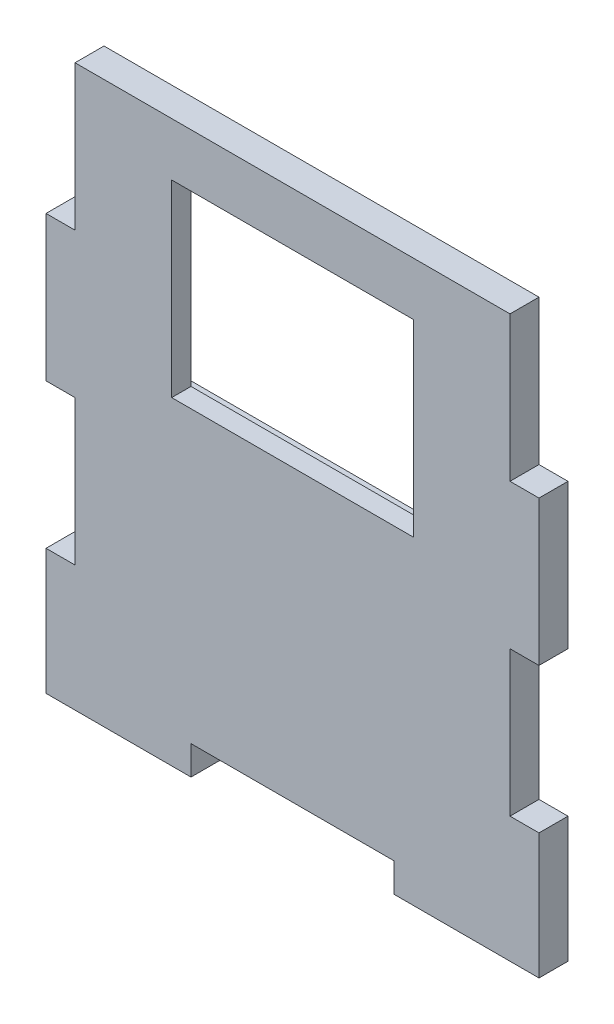
ISO-10303-21;
HEADER;
FILE_DESCRIPTION(('STEP AP214'),'2;1');
FILE_NAME('part.step','',(''),(''),'','','');
FILE_SCHEMA(('AUTOMOTIVE_DESIGN { 1 0 10303 214 1 1 1 1 }'));
ENDSEC;
DATA;
#1=APPLICATION_CONTEXT('core data for automotive mechanical design processes');
#2=APPLICATION_PROTOCOL_DEFINITION('international standard','automotive_design',2000,#1);
#3=PRODUCT_CONTEXT('',#1,'mechanical');
#4=PRODUCT('Part','Part','',(#3));
#5=PRODUCT_RELATED_PRODUCT_CATEGORY('part','',(#4));
#6=PRODUCT_DEFINITION_FORMATION('','',#4);
#7=PRODUCT_DEFINITION_CONTEXT('part definition',#1,'design');
#8=PRODUCT_DEFINITION('design','',#6,#7);
#9=PRODUCT_DEFINITION_SHAPE('','',#8);
#10=(LENGTH_UNIT() NAMED_UNIT(*) SI_UNIT(.MILLI.,.METRE.));
#11=(NAMED_UNIT(*) PLANE_ANGLE_UNIT() SI_UNIT($,.RADIAN.));
#12=(NAMED_UNIT(*) SI_UNIT($,.STERADIAN.) SOLID_ANGLE_UNIT());
#13=UNCERTAINTY_MEASURE_WITH_UNIT(LENGTH_MEASURE(1.E-05),#10,'distance_accuracy_value','');
#14=(GEOMETRIC_REPRESENTATION_CONTEXT(3) GLOBAL_UNCERTAINTY_ASSIGNED_CONTEXT((#13)) GLOBAL_UNIT_ASSIGNED_CONTEXT((#10,
#11,#12)) REPRESENTATION_CONTEXT('',''));
#15=CARTESIAN_POINT('',(0.,0.,0.));
#16=DIRECTION('',(0.,0.,1.));
#17=DIRECTION('',(1.,0.,0.));
#18=AXIS2_PLACEMENT_3D('',#15,#16,#17);
#19=CARTESIAN_POINT('',(-50.001,40.,75.));
#20=DIRECTION('',(0.,1.,0.));
#21=DIRECTION('',(0.,0.,1.));
#22=AXIS2_PLACEMENT_3D('',#19,#20,#21);
#23=PLANE('',#22);
#24=DIRECTION('',(0.,0.,1.));
#25=VECTOR('',#24,1.);
#26=CARTESIAN_POINT('',(-21.,40.,76.));
#27=LINE('',#26,#25);
#28=CARTESIAN_POINT('',(-21.,40.,70.));
#29=VERTEX_POINT('',#28);
#30=CARTESIAN_POINT('',(-21.,40.,76.));
#31=VERTEX_POINT('',#30);
#32=EDGE_CURVE('E275',#29,#31,#27,.T.);
#33=ORIENTED_EDGE('',*,*,#32,.F.);
#34=DIRECTION('',(1.,0.,0.));
#35=VECTOR('',#34,1.);
#36=CARTESIAN_POINT('',(-50.001,40.,70.));
#37=LINE('',#36,#35);
#38=CARTESIAN_POINT('',(21.,40.,70.));
#39=VERTEX_POINT('',#38);
#40=EDGE_CURVE('E417',#29,#39,#37,.T.);
#41=ORIENTED_EDGE('',*,*,#40,.T.);
#42=DIRECTION('',(0.,0.,-1.));
#43=VECTOR('',#42,1.);
#44=CARTESIAN_POINT('',(21.,40.,76.));
#45=LINE('',#44,#43);
#46=CARTESIAN_POINT('',(21.,40.,76.));
#47=VERTEX_POINT('',#46);
#48=EDGE_CURVE('E284',#47,#39,#45,.T.);
#49=ORIENTED_EDGE('',*,*,#48,.F.);
#50=DIRECTION('',(1.,0.,0.));
#51=VECTOR('',#50,1.);
#52=CARTESIAN_POINT('',(-50.,40.,76.));
#53=LINE('',#52,#51);
#54=EDGE_CURVE('E55',#31,#47,#53,.T.);
#55=ORIENTED_EDGE('',*,*,#54,.F.);
#56=EDGE_LOOP('',(#33,#41,#49,#55));
#57=FACE_BOUND('',#56,.T.);
#58=ADVANCED_FACE('F40',(#57),#23,.F.);
#59=CARTESIAN_POINT('',(-50.,150.,70.));
#60=DIRECTION('',(0.,0.,-1.));
#61=DIRECTION('',(-1.,0.,0.));
#62=AXIS2_PLACEMENT_3D('',#59,#60,#61);
#63=PLANE('',#62);
#64=DIRECTION('',(0.,1.,0.));
#65=VECTOR('',#64,1.);
#66=CARTESIAN_POINT('',(-23.,150.,70.));
#67=LINE('',#66,#65);
#68=CARTESIAN_POINT('',(-23.,51.,70.));
#69=VERTEX_POINT('',#68);
#70=CARTESIAN_POINT('',(-23.,96.,70.));
#71=VERTEX_POINT('',#70);
#72=EDGE_CURVE('E11',#69,#71,#67,.T.);
#73=ORIENTED_EDGE('',*,*,#72,.F.);
#74=DIRECTION('',(-1.,0.,0.));
#75=VECTOR('',#74,1.);
#76=CARTESIAN_POINT('',(-50.,51.,70.));
#77=LINE('',#76,#75);
#78=CARTESIAN_POINT('',(23.,51.,70.));
#79=VERTEX_POINT('',#78);
#80=EDGE_CURVE('E489',#79,#69,#77,.T.);
#81=ORIENTED_EDGE('',*,*,#80,.F.);
#82=DIRECTION('',(0.,-1.,0.));
#83=VECTOR('',#82,1.);
#84=CARTESIAN_POINT('',(23.,150.,70.));
#85=LINE('',#84,#83);
#86=CARTESIAN_POINT('',(23.,96.,70.));
#87=VERTEX_POINT('',#86);
#88=EDGE_CURVE('E491',#87,#79,#85,.T.);
#89=ORIENTED_EDGE('',*,*,#88,.F.);
#90=DIRECTION('',(1.,0.,0.));
#91=VECTOR('',#90,1.);
#92=CARTESIAN_POINT('',(-50.,96.,70.));
#93=LINE('',#92,#91);
#94=EDGE_CURVE('E48',#71,#87,#93,.T.);
#95=ORIENTED_EDGE('',*,*,#94,.F.);
#96=EDGE_LOOP('',(#73,#81,#89,#95));
#97=FACE_BOUND('',#96,.T.);
#98=DIRECTION('',(0.,1.,0.));
#99=VECTOR('',#98,1.);
#100=CARTESIAN_POINT('',(-30.,99.,70.));
#101=LINE('',#100,#99);
#102=CARTESIAN_POINT('',(-30.,99.,70.));
#103=VERTEX_POINT('',#102);
#104=CARTESIAN_POINT('',(-30.,140.,70.));
#105=VERTEX_POINT('',#104);
#106=EDGE_CURVE('E434',#103,#105,#101,.T.);
#107=ORIENTED_EDGE('',*,*,#106,.F.);
#108=DIRECTION('',(-1.,0.,0.));
#109=VECTOR('',#108,1.);
#110=CARTESIAN_POINT('',(-30.,99.,70.));
#111=LINE('',#110,#109);
#112=CARTESIAN_POINT('',(26.,99.,70.));
#113=VERTEX_POINT('',#112);
#114=EDGE_CURVE('E444',#113,#103,#111,.T.);
#115=ORIENTED_EDGE('',*,*,#114,.F.);
#116=DIRECTION('',(0.,-1.,0.));
#117=VECTOR('',#116,1.);
#118=CARTESIAN_POINT('',(26.,99.,70.));
#119=LINE('',#118,#117);
#120=CARTESIAN_POINT('',(26.,140.,70.));
#121=VERTEX_POINT('',#120);
#122=EDGE_CURVE('E458',#121,#113,#119,.T.);
#123=ORIENTED_EDGE('',*,*,#122,.F.);
#124=DIRECTION('',(1.,0.,0.));
#125=VECTOR('',#124,1.);
#126=CARTESIAN_POINT('',(-30.,140.,70.));
#127=LINE('',#126,#125);
#128=EDGE_CURVE('E455',#105,#121,#127,.T.);
#129=ORIENTED_EDGE('',*,*,#128,.F.);
#130=EDGE_LOOP('',(#107,#115,#123,#129));
#131=FACE_BOUND('',#130,.T.);
#132=DIRECTION('',(0.,-1.,0.));
#133=VECTOR('',#132,1.);
#134=CARTESIAN_POINT('',(-45.,90.,70.));
#135=LINE('',#134,#133);
#136=CARTESIAN_POINT('',(-45.,90.,70.));
#137=VERTEX_POINT('',#136);
#138=CARTESIAN_POINT('',(-45.,60.,70.));
#139=VERTEX_POINT('',#138);
#140=EDGE_CURVE('E303',#137,#139,#135,.T.);
#141=ORIENTED_EDGE('',*,*,#140,.F.);
#142=DIRECTION('',(1.,0.,0.));
#143=VECTOR('',#142,1.);
#144=CARTESIAN_POINT('',(-51.,90.,70.));
#145=LINE('',#144,#143);
#146=CARTESIAN_POINT('',(-51.,90.,70.));
#147=VERTEX_POINT('',#146);
#148=EDGE_CURVE('E306',#147,#137,#145,.T.);
#149=ORIENTED_EDGE('',*,*,#148,.F.);
#150=DIRECTION('',(0.,-1.,0.));
#151=VECTOR('',#150,1.);
#152=CARTESIAN_POINT('',(-51.,150.,70.));
#153=LINE('',#152,#151);
#154=CARTESIAN_POINT('',(-51.,120.,70.));
#155=VERTEX_POINT('',#154);
#156=EDGE_CURVE('E258',#155,#147,#153,.T.);
#157=ORIENTED_EDGE('',*,*,#156,.F.);
#158=DIRECTION('',(-1.,0.,0.));
#159=VECTOR('',#158,1.);
#160=CARTESIAN_POINT('',(-51.,120.,70.));
#161=LINE('',#160,#159);
#162=CARTESIAN_POINT('',(-45.,120.,70.));
#163=VERTEX_POINT('',#162);
#164=EDGE_CURVE('E340',#163,#155,#161,.T.);
#165=ORIENTED_EDGE('',*,*,#164,.F.);
#166=DIRECTION('',(0.,-1.,0.));
#167=VECTOR('',#166,1.);
#168=CARTESIAN_POINT('',(-45.,150.,70.));
#169=LINE('',#168,#167);
#170=CARTESIAN_POINT('',(-45.,150.,70.));
#171=VERTEX_POINT('',#170);
#172=EDGE_CURVE('E327',#171,#163,#169,.T.);
#173=ORIENTED_EDGE('',*,*,#172,.F.);
#174=DIRECTION('',(1.,0.,0.));
#175=VECTOR('',#174,1.);
#176=CARTESIAN_POINT('',(0.,150.,70.));
#177=LINE('',#176,#175);
#178=CARTESIAN_POINT('',(45.,150.,70.));
#179=VERTEX_POINT('',#178);
#180=EDGE_CURVE('E480',#171,#179,#177,.T.);
#181=ORIENTED_EDGE('',*,*,#180,.T.);
#182=DIRECTION('',(0.,-1.,0.));
#183=VECTOR('',#182,1.);
#184=CARTESIAN_POINT('',(45.,150.,70.));
#185=LINE('',#184,#183);
#186=CARTESIAN_POINT('',(45.,120.,70.));
#187=VERTEX_POINT('',#186);
#188=EDGE_CURVE('E372',#179,#187,#185,.T.);
#189=ORIENTED_EDGE('',*,*,#188,.T.);
#190=DIRECTION('',(1.,0.,0.));
#191=VECTOR('',#190,1.);
#192=CARTESIAN_POINT('',(51.,120.,70.));
#193=LINE('',#192,#191);
#194=CARTESIAN_POINT('',(51.,120.,70.));
#195=VERTEX_POINT('',#194);
#196=EDGE_CURVE('E375',#187,#195,#193,.T.);
#197=ORIENTED_EDGE('',*,*,#196,.T.);
#198=DIRECTION('',(0.,1.,0.));
#199=VECTOR('',#198,1.);
#200=CARTESIAN_POINT('',(51.,150.,70.));
#201=LINE('',#200,#199);
#202=CARTESIAN_POINT('',(51.,90.,70.));
#203=VERTEX_POINT('',#202);
#204=EDGE_CURVE('E397',#203,#195,#201,.T.);
#205=ORIENTED_EDGE('',*,*,#204,.F.);
#206=DIRECTION('',(-1.,0.,0.));
#207=VECTOR('',#206,1.);
#208=CARTESIAN_POINT('',(51.,90.,70.));
#209=LINE('',#208,#207);
#210=CARTESIAN_POINT('',(45.,90.,70.));
#211=VERTEX_POINT('',#210);
#212=EDGE_CURVE('E364',#203,#211,#209,.T.);
#213=ORIENTED_EDGE('',*,*,#212,.T.);
#214=DIRECTION('',(0.,-1.,0.));
#215=VECTOR('',#214,1.);
#216=CARTESIAN_POINT('',(45.,90.,70.));
#217=LINE('',#216,#215);
#218=CARTESIAN_POINT('',(45.,60.,70.));
#219=VERTEX_POINT('',#218);
#220=EDGE_CURVE('E346',#211,#219,#217,.T.);
#221=ORIENTED_EDGE('',*,*,#220,.T.);
#222=DIRECTION('',(1.,0.,0.));
#223=VECTOR('',#222,1.);
#224=CARTESIAN_POINT('',(51.,60.,70.));
#225=LINE('',#224,#223);
#226=CARTESIAN_POINT('',(51.,60.,70.));
#227=VERTEX_POINT('',#226);
#228=EDGE_CURVE('E349',#219,#227,#225,.T.);
#229=ORIENTED_EDGE('',*,*,#228,.T.);
#230=CARTESIAN_POINT('',(51.,34.,70.));
#231=VERTEX_POINT('',#230);
#232=EDGE_CURVE('E398',#231,#227,#201,.T.);
#233=ORIENTED_EDGE('',*,*,#232,.F.);
#234=DIRECTION('',(1.,0.,0.));
#235=VECTOR('',#234,1.);
#236=CARTESIAN_POINT('',(51.,34.,70.));
#237=LINE('',#236,#235);
#238=CARTESIAN_POINT('',(21.,34.,70.));
#239=VERTEX_POINT('',#238);
#240=EDGE_CURVE('E292',#239,#231,#237,.T.);
#241=ORIENTED_EDGE('',*,*,#240,.F.);
#242=DIRECTION('',(0.,1.,0.));
#243=VECTOR('',#242,1.);
#244=CARTESIAN_POINT('',(21.,34.,70.));
#245=LINE('',#244,#243);
#246=EDGE_CURVE('E295',#239,#39,#245,.T.);
#247=ORIENTED_EDGE('',*,*,#246,.T.);
#248=ORIENTED_EDGE('',*,*,#40,.F.);
#249=DIRECTION('',(0.,1.,0.));
#250=VECTOR('',#249,1.);
#251=CARTESIAN_POINT('',(-21.,34.,70.));
#252=LINE('',#251,#250);
#253=CARTESIAN_POINT('',(-21.,34.,70.));
#254=VERTEX_POINT('',#253);
#255=EDGE_CURVE('E266',#254,#29,#252,.T.);
#256=ORIENTED_EDGE('',*,*,#255,.F.);
#257=DIRECTION('',(1.,0.,0.));
#258=VECTOR('',#257,1.);
#259=CARTESIAN_POINT('',(-51.,34.,70.));
#260=LINE('',#259,#258);
#261=CARTESIAN_POINT('',(-51.,34.,70.));
#262=VERTEX_POINT('',#261);
#263=EDGE_CURVE('E262',#262,#254,#260,.T.);
#264=ORIENTED_EDGE('',*,*,#263,.F.);
#265=CARTESIAN_POINT('',(-51.,60.,70.));
#266=VERTEX_POINT('',#265);
#267=EDGE_CURVE('E250',#266,#262,#153,.T.);
#268=ORIENTED_EDGE('',*,*,#267,.F.);
#269=DIRECTION('',(-1.,0.,0.));
#270=VECTOR('',#269,1.);
#271=CARTESIAN_POINT('',(-51.,60.,70.));
#272=LINE('',#271,#270);
#273=EDGE_CURVE('E63',#139,#266,#272,.T.);
#274=ORIENTED_EDGE('',*,*,#273,.F.);
#275=EDGE_LOOP('',(#141,#149,#157,#165,#173,#181,#189,#197,#205,#213,#221,#229,#233,#241,#247,
#248,#256,#264,#268,#274));
#276=FACE_BOUND('',#275,.T.);
#277=ADVANCED_FACE('F264',(#97,#131,#276),#63,.T.);
#278=CARTESIAN_POINT('',(0.,0.,76.));
#279=DIRECTION('',(0.,0.,-1.));
#280=DIRECTION('',(-1.,0.,0.));
#281=AXIS2_PLACEMENT_3D('',#278,#279,#280);
#282=PLANE('',#281);
#283=DIRECTION('',(1.,0.,0.));
#284=VECTOR('',#283,1.);
#285=CARTESIAN_POINT('',(25.,139.,76.));
#286=LINE('',#285,#284);
#287=CARTESIAN_POINT('',(-25.,139.,76.));
#288=VERTEX_POINT('',#287);
#289=CARTESIAN_POINT('',(25.,139.,76.));
#290=VERTEX_POINT('',#289);
#291=EDGE_CURVE('E410',#288,#290,#286,.T.);
#292=ORIENTED_EDGE('',*,*,#291,.T.);
#293=DIRECTION('',(0.,-1.,0.));
#294=VECTOR('',#293,1.);
#295=CARTESIAN_POINT('',(25.,139.,76.));
#296=LINE('',#295,#294);
#297=CARTESIAN_POINT('',(25.,100.,76.));
#298=VERTEX_POINT('',#297);
#299=EDGE_CURVE('E401',#290,#298,#296,.T.);
#300=ORIENTED_EDGE('',*,*,#299,.T.);
#301=DIRECTION('',(-1.,0.,0.));
#302=VECTOR('',#301,1.);
#303=CARTESIAN_POINT('',(25.,100.,76.));
#304=LINE('',#303,#302);
#305=CARTESIAN_POINT('',(-25.,100.,76.));
#306=VERTEX_POINT('',#305);
#307=EDGE_CURVE('E404',#298,#306,#304,.T.);
#308=ORIENTED_EDGE('',*,*,#307,.T.);
#309=DIRECTION('',(0.,1.,0.));
#310=VECTOR('',#309,1.);
#311=CARTESIAN_POINT('',(-25.,139.,76.));
#312=LINE('',#311,#310);
#313=EDGE_CURVE('E407',#306,#288,#312,.T.);
#314=ORIENTED_EDGE('',*,*,#313,.T.);
#315=EDGE_LOOP('',(#292,#300,#308,#314));
#316=FACE_BOUND('',#315,.T.);
#317=DIRECTION('',(1.,0.,0.));
#318=VECTOR('',#317,1.);
#319=CARTESIAN_POINT('',(-51.,90.,76.));
#320=LINE('',#319,#318);
#321=CARTESIAN_POINT('',(-51.,90.,76.));
#322=VERTEX_POINT('',#321);
#323=CARTESIAN_POINT('',(-45.,90.,76.));
#324=VERTEX_POINT('',#323);
#325=EDGE_CURVE('E315',#322,#324,#320,.T.);
#326=ORIENTED_EDGE('',*,*,#325,.T.);
#327=DIRECTION('',(0.,-1.,0.));
#328=VECTOR('',#327,1.);
#329=CARTESIAN_POINT('',(-45.,90.,76.));
#330=LINE('',#329,#328);
#331=CARTESIAN_POINT('',(-45.,60.,76.));
#332=VERTEX_POINT('',#331);
#333=EDGE_CURVE('E312',#324,#332,#330,.T.);
#334=ORIENTED_EDGE('',*,*,#333,.T.);
#335=DIRECTION('',(-1.,0.,0.));
#336=VECTOR('',#335,1.);
#337=CARTESIAN_POINT('',(-51.,60.,76.));
#338=LINE('',#337,#336);
#339=CARTESIAN_POINT('',(-51.,60.,76.));
#340=VERTEX_POINT('',#339);
#341=EDGE_CURVE('E309',#332,#340,#338,.T.);
#342=ORIENTED_EDGE('',*,*,#341,.T.);
#343=DIRECTION('',(0.,1.,0.));
#344=VECTOR('',#343,1.);
#345=CARTESIAN_POINT('',(-51.,150.,76.));
#346=LINE('',#345,#344);
#347=CARTESIAN_POINT('',(-51.,34.,76.));
#348=VERTEX_POINT('',#347);
#349=EDGE_CURVE('E259',#348,#340,#346,.T.);
#350=ORIENTED_EDGE('',*,*,#349,.F.);
#351=DIRECTION('',(-1.,0.,0.));
#352=VECTOR('',#351,1.);
#353=CARTESIAN_POINT('',(-51.,34.,76.));
#354=LINE('',#353,#352);
#355=CARTESIAN_POINT('',(-21.,34.,76.));
#356=VERTEX_POINT('',#355);
#357=EDGE_CURVE('E274',#356,#348,#354,.T.);
#358=ORIENTED_EDGE('',*,*,#357,.F.);
#359=DIRECTION('',(0.,1.,0.));
#360=VECTOR('',#359,1.);
#361=CARTESIAN_POINT('',(-21.,34.,76.));
#362=LINE('',#361,#360);
#363=EDGE_CURVE('E280',#356,#31,#362,.T.);
#364=ORIENTED_EDGE('',*,*,#363,.T.);
#365=ORIENTED_EDGE('',*,*,#54,.T.);
#366=DIRECTION('',(0.,1.,0.));
#367=VECTOR('',#366,1.);
#368=CARTESIAN_POINT('',(21.,34.,76.));
#369=LINE('',#368,#367);
#370=CARTESIAN_POINT('',(21.,34.,76.));
#371=VERTEX_POINT('',#370);
#372=EDGE_CURVE('E300',#371,#47,#369,.T.);
#373=ORIENTED_EDGE('',*,*,#372,.F.);
#374=DIRECTION('',(-1.,0.,0.));
#375=VECTOR('',#374,1.);
#376=CARTESIAN_POINT('',(51.,34.,76.));
#377=LINE('',#376,#375);
#378=CARTESIAN_POINT('',(51.,34.,76.));
#379=VERTEX_POINT('',#378);
#380=EDGE_CURVE('E288',#379,#371,#377,.T.);
#381=ORIENTED_EDGE('',*,*,#380,.F.);
#382=DIRECTION('',(0.,-1.,0.));
#383=VECTOR('',#382,1.);
#384=CARTESIAN_POINT('',(51.,150.,76.));
#385=LINE('',#384,#383);
#386=CARTESIAN_POINT('',(51.,60.,76.));
#387=VERTEX_POINT('',#386);
#388=EDGE_CURVE('E393',#387,#379,#385,.T.);
#389=ORIENTED_EDGE('',*,*,#388,.F.);
#390=DIRECTION('',(1.,0.,0.));
#391=VECTOR('',#390,1.);
#392=CARTESIAN_POINT('',(51.,60.,76.));
#393=LINE('',#392,#391);
#394=CARTESIAN_POINT('',(45.,60.,76.));
#395=VERTEX_POINT('',#394);
#396=EDGE_CURVE('E358',#395,#387,#393,.T.);
#397=ORIENTED_EDGE('',*,*,#396,.F.);
#398=DIRECTION('',(0.,-1.,0.));
#399=VECTOR('',#398,1.);
#400=CARTESIAN_POINT('',(45.,90.,76.));
#401=LINE('',#400,#399);
#402=CARTESIAN_POINT('',(45.,90.,76.));
#403=VERTEX_POINT('',#402);
#404=EDGE_CURVE('E355',#403,#395,#401,.T.);
#405=ORIENTED_EDGE('',*,*,#404,.F.);
#406=DIRECTION('',(-1.,0.,0.));
#407=VECTOR('',#406,1.);
#408=CARTESIAN_POINT('',(51.,90.,76.));
#409=LINE('',#408,#407);
#410=CARTESIAN_POINT('',(51.,90.,76.));
#411=VERTEX_POINT('',#410);
#412=EDGE_CURVE('E352',#411,#403,#409,.T.);
#413=ORIENTED_EDGE('',*,*,#412,.F.);
#414=CARTESIAN_POINT('',(51.,120.,76.));
#415=VERTEX_POINT('',#414);
#416=EDGE_CURVE('E394',#415,#411,#385,.T.);
#417=ORIENTED_EDGE('',*,*,#416,.F.);
#418=DIRECTION('',(1.,0.,0.));
#419=VECTOR('',#418,1.);
#420=CARTESIAN_POINT('',(51.,120.,76.));
#421=LINE('',#420,#419);
#422=CARTESIAN_POINT('',(45.,120.,76.));
#423=VERTEX_POINT('',#422);
#424=EDGE_CURVE('E381',#423,#415,#421,.T.);
#425=ORIENTED_EDGE('',*,*,#424,.F.);
#426=DIRECTION('',(0.,-1.,0.));
#427=VECTOR('',#426,1.);
#428=CARTESIAN_POINT('',(45.,150.,76.));
#429=LINE('',#428,#427);
#430=CARTESIAN_POINT('',(45.,150.,76.));
#431=VERTEX_POINT('',#430);
#432=EDGE_CURVE('E378',#431,#423,#429,.T.);
#433=ORIENTED_EDGE('',*,*,#432,.F.);
#434=DIRECTION('',(-1.,0.,0.));
#435=VECTOR('',#434,1.);
#436=CARTESIAN_POINT('',(-50.,150.,76.));
#437=LINE('',#436,#435);
#438=CARTESIAN_POINT('',(-45.,150.,76.));
#439=VERTEX_POINT('',#438);
#440=EDGE_CURVE('E414',#431,#439,#437,.T.);
#441=ORIENTED_EDGE('',*,*,#440,.T.);
#442=DIRECTION('',(0.,-1.,0.));
#443=VECTOR('',#442,1.);
#444=CARTESIAN_POINT('',(-45.,150.,76.));
#445=LINE('',#444,#443);
#446=CARTESIAN_POINT('',(-45.,120.,76.));
#447=VERTEX_POINT('',#446);
#448=EDGE_CURVE('E333',#439,#447,#445,.T.);
#449=ORIENTED_EDGE('',*,*,#448,.T.);
#450=DIRECTION('',(-1.,0.,0.));
#451=VECTOR('',#450,1.);
#452=CARTESIAN_POINT('',(-51.,120.,76.));
#453=LINE('',#452,#451);
#454=CARTESIAN_POINT('',(-51.,120.,76.));
#455=VERTEX_POINT('',#454);
#456=EDGE_CURVE('E330',#447,#455,#453,.T.);
#457=ORIENTED_EDGE('',*,*,#456,.T.);
#458=EDGE_CURVE('E387',#322,#455,#346,.T.);
#459=ORIENTED_EDGE('',*,*,#458,.F.);
#460=EDGE_LOOP('',(#326,#334,#342,#350,#358,#364,#365,#373,#381,#389,#397,#405,#413,#417,#425,
#433,#441,#449,#457,#459));
#461=FACE_BOUND('',#460,.T.);
#462=ADVANCED_FACE('F534',(#316,#461),#282,.F.);
#463=CARTESIAN_POINT('',(-51.,0.,0.));
#464=DIRECTION('',(1.,0.,0.));
#465=DIRECTION('',(0.,0.,-1.));
#466=AXIS2_PLACEMENT_3D('',#463,#464,#465);
#467=PLANE('',#466);
#468=DIRECTION('',(0.,0.,1.));
#469=VECTOR('',#468,1.);
#470=CARTESIAN_POINT('',(-51.,90.,69.999));
#471=LINE('',#470,#469);
#472=EDGE_CURVE('E318',#147,#322,#471,.T.);
#473=ORIENTED_EDGE('',*,*,#472,.T.);
#474=ORIENTED_EDGE('',*,*,#458,.T.);
#475=DIRECTION('',(0.,0.,1.));
#476=VECTOR('',#475,1.);
#477=CARTESIAN_POINT('',(-51.,120.,69.999));
#478=LINE('',#477,#476);
#479=EDGE_CURVE('E336',#155,#455,#478,.T.);
#480=ORIENTED_EDGE('',*,*,#479,.F.);
#481=ORIENTED_EDGE('',*,*,#156,.T.);
#482=EDGE_LOOP('',(#473,#474,#480,#481));
#483=FACE_BOUND('',#482,.T.);
#484=ADVANCED_FACE('F540',(#483),#467,.F.);
#485=DIRECTION('',(0.,0.,1.));
#486=VECTOR('',#485,1.);
#487=CARTESIAN_POINT('',(-51.,60.,69.999));
#488=LINE('',#487,#486);
#489=EDGE_CURVE('E256',#266,#340,#488,.T.);
#490=ORIENTED_EDGE('',*,*,#489,.F.);
#491=ORIENTED_EDGE('',*,*,#267,.T.);
#492=DIRECTION('',(0.,0.,-1.));
#493=VECTOR('',#492,1.);
#494=CARTESIAN_POINT('',(-51.,34.,76.));
#495=LINE('',#494,#493);
#496=EDGE_CURVE('E255',#348,#262,#495,.T.);
#497=ORIENTED_EDGE('',*,*,#496,.F.);
#498=ORIENTED_EDGE('',*,*,#349,.T.);
#499=EDGE_LOOP('',(#490,#491,#497,#498));
#500=FACE_BOUND('',#499,.T.);
#501=ADVANCED_FACE('F252',(#500),#467,.F.);
#502=CARTESIAN_POINT('',(0.,150.,0.));
#503=DIRECTION('',(0.,-1.,0.));
#504=DIRECTION('',(0.,0.,-1.));
#505=AXIS2_PLACEMENT_3D('',#502,#503,#504);
#506=PLANE('',#505);
#507=DIRECTION('',(0.,0.,1.));
#508=VECTOR('',#507,1.);
#509=CARTESIAN_POINT('',(-45.,150.,69.999));
#510=LINE('',#509,#508);
#511=EDGE_CURVE('E337',#171,#439,#510,.T.);
#512=ORIENTED_EDGE('',*,*,#511,.T.);
#513=ORIENTED_EDGE('',*,*,#440,.F.);
#514=DIRECTION('',(0.,0.,1.));
#515=VECTOR('',#514,1.);
#516=CARTESIAN_POINT('',(45.,150.,69.999));
#517=LINE('',#516,#515);
#518=EDGE_CURVE('E383',#179,#431,#517,.T.);
#519=ORIENTED_EDGE('',*,*,#518,.F.);
#520=ORIENTED_EDGE('',*,*,#180,.F.);
#521=EDGE_LOOP('',(#512,#513,#519,#520));
#522=FACE_BOUND('',#521,.T.);
#523=ADVANCED_FACE('F42',(#522),#506,.F.);
#524=CARTESIAN_POINT('',(51.,0.,0.));
#525=DIRECTION('',(1.,0.,0.));
#526=DIRECTION('',(0.,0.,-1.));
#527=AXIS2_PLACEMENT_3D('',#524,#525,#526);
#528=PLANE('',#527);
#529=DIRECTION('',(0.,0.,1.));
#530=VECTOR('',#529,1.);
#531=CARTESIAN_POINT('',(51.,60.,69.999));
#532=LINE('',#531,#530);
#533=EDGE_CURVE('E361',#227,#387,#532,.T.);
#534=ORIENTED_EDGE('',*,*,#533,.T.);
#535=ORIENTED_EDGE('',*,*,#388,.T.);
#536=DIRECTION('',(0.,0.,1.));
#537=VECTOR('',#536,1.);
#538=CARTESIAN_POINT('',(51.,34.,76.));
#539=LINE('',#538,#537);
#540=EDGE_CURVE('E285',#231,#379,#539,.T.);
#541=ORIENTED_EDGE('',*,*,#540,.F.);
#542=ORIENTED_EDGE('',*,*,#232,.T.);
#543=EDGE_LOOP('',(#534,#535,#541,#542));
#544=FACE_BOUND('',#543,.T.);
#545=ADVANCED_FACE('F526',(#544),#528,.T.);
#546=CARTESIAN_POINT('',(-25.,139.,-75.001));
#547=DIRECTION('',(0.,1.,0.));
#548=DIRECTION('',(0.,0.,1.));
#549=AXIS2_PLACEMENT_3D('',#546,#547,#548);
#550=PLANE('',#549);
#551=DIRECTION('',(-1.,0.,0.));
#552=VECTOR('',#551,1.);
#553=CARTESIAN_POINT('',(-25.,139.,72.));
#554=LINE('',#553,#552);
#555=CARTESIAN_POINT('',(25.,139.,72.));
#556=VERTEX_POINT('',#555);
#557=CARTESIAN_POINT('',(-25.,139.,72.));
#558=VERTEX_POINT('',#557);
#559=EDGE_CURVE('E475',#556,#558,#554,.T.);
#560=ORIENTED_EDGE('',*,*,#559,.F.);
#561=DIRECTION('',(0.,0.,1.));
#562=VECTOR('',#561,1.);
#563=CARTESIAN_POINT('',(25.,139.,-75.001));
#564=LINE('',#563,#562);
#565=EDGE_CURVE('E477',#556,#290,#564,.T.);
#566=ORIENTED_EDGE('',*,*,#565,.T.);
#567=ORIENTED_EDGE('',*,*,#291,.F.);
#568=DIRECTION('',(0.,0.,1.));
#569=VECTOR('',#568,1.);
#570=CARTESIAN_POINT('',(-25.,139.,-75.001));
#571=LINE('',#570,#569);
#572=EDGE_CURVE('E483',#558,#288,#571,.T.);
#573=ORIENTED_EDGE('',*,*,#572,.F.);
#574=EDGE_LOOP('',(#560,#566,#567,#573));
#575=FACE_BOUND('',#574,.T.);
#576=ADVANCED_FACE('F548',(#575),#550,.F.);
#577=CARTESIAN_POINT('',(-25.,100.,-75.001));
#578=DIRECTION('',(-1.,0.,0.));
#579=DIRECTION('',(0.,0.,1.));
#580=AXIS2_PLACEMENT_3D('',#577,#578,#579);
#581=PLANE('',#580);
#582=DIRECTION('',(0.,-1.,0.));
#583=VECTOR('',#582,1.);
#584=CARTESIAN_POINT('',(-25.,100.,72.));
#585=LINE('',#584,#583);
#586=CARTESIAN_POINT('',(-25.,100.,72.));
#587=VERTEX_POINT('',#586);
#588=EDGE_CURVE('E473',#558,#587,#585,.T.);
#589=ORIENTED_EDGE('',*,*,#588,.F.);
#590=ORIENTED_EDGE('',*,*,#572,.T.);
#591=ORIENTED_EDGE('',*,*,#313,.F.);
#592=DIRECTION('',(0.,0.,1.));
#593=VECTOR('',#592,1.);
#594=CARTESIAN_POINT('',(-25.,100.,-75.001));
#595=LINE('',#594,#593);
#596=EDGE_CURVE('E481',#587,#306,#595,.T.);
#597=ORIENTED_EDGE('',*,*,#596,.F.);
#598=EDGE_LOOP('',(#589,#590,#591,#597));
#599=FACE_BOUND('',#598,.T.);
#600=ADVANCED_FACE('F551',(#599),#581,.F.);
#601=CARTESIAN_POINT('',(-25.,100.,-75.001));
#602=DIRECTION('',(0.,-1.,0.));
#603=DIRECTION('',(0.,0.,-1.));
#604=AXIS2_PLACEMENT_3D('',#601,#602,#603);
#605=PLANE('',#604);
#606=DIRECTION('',(1.,0.,0.));
#607=VECTOR('',#606,1.);
#608=CARTESIAN_POINT('',(-25.,100.,72.));
#609=LINE('',#608,#607);
#610=CARTESIAN_POINT('',(25.,100.,72.));
#611=VERTEX_POINT('',#610);
#612=EDGE_CURVE('E465',#587,#611,#609,.T.);
#613=ORIENTED_EDGE('',*,*,#612,.F.);
#614=ORIENTED_EDGE('',*,*,#596,.T.);
#615=ORIENTED_EDGE('',*,*,#307,.F.);
#616=DIRECTION('',(0.,0.,1.));
#617=VECTOR('',#616,1.);
#618=CARTESIAN_POINT('',(25.,100.,-75.001));
#619=LINE('',#618,#617);
#620=EDGE_CURVE('E478',#611,#298,#619,.T.);
#621=ORIENTED_EDGE('',*,*,#620,.F.);
#622=EDGE_LOOP('',(#613,#614,#615,#621));
#623=FACE_BOUND('',#622,.T.);
#624=ADVANCED_FACE('F546',(#623),#605,.F.);
#625=CARTESIAN_POINT('',(25.,100.,-75.001));
#626=DIRECTION('',(1.,0.,0.));
#627=DIRECTION('',(0.,0.,-1.));
#628=AXIS2_PLACEMENT_3D('',#625,#626,#627);
#629=PLANE('',#628);
#630=DIRECTION('',(0.,1.,0.));
#631=VECTOR('',#630,1.);
#632=CARTESIAN_POINT('',(25.,100.,72.));
#633=LINE('',#632,#631);
#634=EDGE_CURVE('E487',#611,#556,#633,.T.);
#635=ORIENTED_EDGE('',*,*,#634,.F.);
#636=ORIENTED_EDGE('',*,*,#620,.T.);
#637=ORIENTED_EDGE('',*,*,#299,.F.);
#638=ORIENTED_EDGE('',*,*,#565,.F.);
#639=EDGE_LOOP('',(#635,#636,#637,#638));
#640=FACE_BOUND('',#639,.T.);
#641=ADVANCED_FACE('F542',(#640),#629,.F.);
#642=CARTESIAN_POINT('',(0.,0.,72.));
#643=DIRECTION('',(0.,0.,-1.));
#644=DIRECTION('',(-1.,0.,0.));
#645=AXIS2_PLACEMENT_3D('',#642,#643,#644);
#646=PLANE('',#645);
#647=DIRECTION('',(0.,1.,0.));
#648=VECTOR('',#647,1.);
#649=CARTESIAN_POINT('',(-30.,99.,72.));
#650=LINE('',#649,#648);
#651=CARTESIAN_POINT('',(-30.,99.,72.));
#652=VERTEX_POINT('',#651);
#653=CARTESIAN_POINT('',(-30.,140.,72.));
#654=VERTEX_POINT('',#653);
#655=EDGE_CURVE('E440',#652,#654,#650,.T.);
#656=ORIENTED_EDGE('',*,*,#655,.T.);
#657=DIRECTION('',(1.,0.,0.));
#658=VECTOR('',#657,1.);
#659=CARTESIAN_POINT('',(-30.,140.,72.));
#660=LINE('',#659,#658);
#661=CARTESIAN_POINT('',(26.,140.,72.));
#662=VERTEX_POINT('',#661);
#663=EDGE_CURVE('E443',#654,#662,#660,.T.);
#664=ORIENTED_EDGE('',*,*,#663,.T.);
#665=DIRECTION('',(0.,-1.,0.));
#666=VECTOR('',#665,1.);
#667=CARTESIAN_POINT('',(26.,99.,72.));
#668=LINE('',#667,#666);
#669=CARTESIAN_POINT('',(26.,99.,72.));
#670=VERTEX_POINT('',#669);
#671=EDGE_CURVE('E447',#662,#670,#668,.T.);
#672=ORIENTED_EDGE('',*,*,#671,.T.);
#673=DIRECTION('',(-1.,0.,0.));
#674=VECTOR('',#673,1.);
#675=CARTESIAN_POINT('',(-30.,99.,72.));
#676=LINE('',#675,#674);
#677=EDGE_CURVE('E450',#670,#652,#676,.T.);
#678=ORIENTED_EDGE('',*,*,#677,.T.);
#679=EDGE_LOOP('',(#656,#664,#672,#678));
#680=FACE_BOUND('',#679,.T.);
#681=ORIENTED_EDGE('',*,*,#559,.T.);
#682=ORIENTED_EDGE('',*,*,#588,.T.);
#683=ORIENTED_EDGE('',*,*,#612,.T.);
#684=ORIENTED_EDGE('',*,*,#634,.T.);
#685=EDGE_LOOP('',(#681,#682,#683,#684));
#686=FACE_BOUND('',#685,.T.);
#687=ADVANCED_FACE('F545',(#680,#686),#646,.T.);
#688=CARTESIAN_POINT('',(-30.,99.,72.));
#689=DIRECTION('',(-1.,0.,0.));
#690=DIRECTION('',(0.,-1.,0.));
#691=AXIS2_PLACEMENT_3D('',#688,#689,#690);
#692=PLANE('',#691);
#693=ORIENTED_EDGE('',*,*,#106,.T.);
#694=DIRECTION('',(0.,0.,-1.));
#695=VECTOR('',#694,1.);
#696=CARTESIAN_POINT('',(-30.,140.,72.));
#697=LINE('',#696,#695);
#698=EDGE_CURVE('E453',#654,#105,#697,.T.);
#699=ORIENTED_EDGE('',*,*,#698,.F.);
#700=ORIENTED_EDGE('',*,*,#655,.F.);
#701=DIRECTION('',(0.,0.,-1.));
#702=VECTOR('',#701,1.);
#703=CARTESIAN_POINT('',(-30.,99.,72.));
#704=LINE('',#703,#702);
#705=EDGE_CURVE('E463',#652,#103,#704,.T.);
#706=ORIENTED_EDGE('',*,*,#705,.T.);
#707=EDGE_LOOP('',(#693,#699,#700,#706));
#708=FACE_BOUND('',#707,.T.);
#709=ADVANCED_FACE('F559',(#708),#692,.F.);
#710=CARTESIAN_POINT('',(-30.,99.,72.));
#711=DIRECTION('',(0.,-1.,0.));
#712=DIRECTION('',(0.,0.,-1.));
#713=AXIS2_PLACEMENT_3D('',#710,#711,#712);
#714=PLANE('',#713);
#715=ORIENTED_EDGE('',*,*,#114,.T.);
#716=ORIENTED_EDGE('',*,*,#705,.F.);
#717=ORIENTED_EDGE('',*,*,#677,.F.);
#718=DIRECTION('',(0.,0.,-1.));
#719=VECTOR('',#718,1.);
#720=CARTESIAN_POINT('',(26.,99.,72.));
#721=LINE('',#720,#719);
#722=EDGE_CURVE('E466',#670,#113,#721,.T.);
#723=ORIENTED_EDGE('',*,*,#722,.T.);
#724=EDGE_LOOP('',(#715,#716,#717,#723));
#725=FACE_BOUND('',#724,.T.);
#726=ADVANCED_FACE('F562',(#725),#714,.F.);
#727=CARTESIAN_POINT('',(26.,99.,72.));
#728=DIRECTION('',(1.,0.,0.));
#729=DIRECTION('',(0.,1.,0.));
#730=AXIS2_PLACEMENT_3D('',#727,#728,#729);
#731=PLANE('',#730);
#732=ORIENTED_EDGE('',*,*,#122,.T.);
#733=ORIENTED_EDGE('',*,*,#722,.F.);
#734=ORIENTED_EDGE('',*,*,#671,.F.);
#735=DIRECTION('',(0.,0.,-1.));
#736=VECTOR('',#735,1.);
#737=CARTESIAN_POINT('',(26.,140.,72.));
#738=LINE('',#737,#736);
#739=EDGE_CURVE('E468',#662,#121,#738,.T.);
#740=ORIENTED_EDGE('',*,*,#739,.T.);
#741=EDGE_LOOP('',(#732,#733,#734,#740));
#742=FACE_BOUND('',#741,.T.);
#743=ADVANCED_FACE('F567',(#742),#731,.F.);
#744=CARTESIAN_POINT('',(-30.,140.,72.));
#745=DIRECTION('',(0.,1.,0.));
#746=DIRECTION('',(0.,0.,1.));
#747=AXIS2_PLACEMENT_3D('',#744,#745,#746);
#748=PLANE('',#747);
#749=ORIENTED_EDGE('',*,*,#128,.T.);
#750=ORIENTED_EDGE('',*,*,#739,.F.);
#751=ORIENTED_EDGE('',*,*,#663,.F.);
#752=ORIENTED_EDGE('',*,*,#698,.T.);
#753=EDGE_LOOP('',(#749,#750,#751,#752));
#754=FACE_BOUND('',#753,.T.);
#755=ADVANCED_FACE('F564',(#754),#748,.F.);
#756=CARTESIAN_POINT('',(-23.,96.,57.));
#757=DIRECTION('',(-1.,0.,0.));
#758=DIRECTION('',(0.,-1.,0.));
#759=AXIS2_PLACEMENT_3D('',#756,#757,#758);
#760=PLANE('',#759);
#761=ORIENTED_EDGE('',*,*,#72,.T.);
#762=DIRECTION('',(0.,0.,1.));
#763=VECTOR('',#762,1.);
#764=CARTESIAN_POINT('',(-23.,96.,57.));
#765=LINE('',#764,#763);
#766=CARTESIAN_POINT('',(-23.,96.,72.));
#767=VERTEX_POINT('',#766);
#768=EDGE_CURVE('E432',#71,#767,#765,.T.);
#769=ORIENTED_EDGE('',*,*,#768,.T.);
#770=DIRECTION('',(0.,-1.,0.));
#771=VECTOR('',#770,1.);
#772=CARTESIAN_POINT('',(-23.,96.,72.));
#773=LINE('',#772,#771);
#774=CARTESIAN_POINT('',(-23.,51.,72.));
#775=VERTEX_POINT('',#774);
#776=EDGE_CURVE('E419',#767,#775,#773,.T.);
#777=ORIENTED_EDGE('',*,*,#776,.T.);
#778=DIRECTION('',(0.,0.,1.));
#779=VECTOR('',#778,1.);
#780=CARTESIAN_POINT('',(-23.,51.,57.));
#781=LINE('',#780,#779);
#782=EDGE_CURVE('E431',#69,#775,#781,.T.);
#783=ORIENTED_EDGE('',*,*,#782,.F.);
#784=EDGE_LOOP('',(#761,#769,#777,#783));
#785=FACE_BOUND('',#784,.T.);
#786=ADVANCED_FACE('F512',(#785),#760,.F.);
#787=CARTESIAN_POINT('',(-23.,96.,57.));
#788=DIRECTION('',(0.,1.,0.));
#789=DIRECTION('',(0.,0.,1.));
#790=AXIS2_PLACEMENT_3D('',#787,#788,#789);
#791=PLANE('',#790);
#792=ORIENTED_EDGE('',*,*,#94,.T.);
#793=DIRECTION('',(0.,0.,1.));
#794=VECTOR('',#793,1.);
#795=CARTESIAN_POINT('',(23.,96.,57.));
#796=LINE('',#795,#794);
#797=CARTESIAN_POINT('',(23.,96.,72.));
#798=VERTEX_POINT('',#797);
#799=EDGE_CURVE('E435',#87,#798,#796,.T.);
#800=ORIENTED_EDGE('',*,*,#799,.T.);
#801=DIRECTION('',(-1.,0.,0.));
#802=VECTOR('',#801,1.);
#803=CARTESIAN_POINT('',(-23.,96.,72.));
#804=LINE('',#803,#802);
#805=EDGE_CURVE('E428',#798,#767,#804,.T.);
#806=ORIENTED_EDGE('',*,*,#805,.T.);
#807=ORIENTED_EDGE('',*,*,#768,.F.);
#808=EDGE_LOOP('',(#792,#800,#806,#807));
#809=FACE_BOUND('',#808,.T.);
#810=ADVANCED_FACE('F497',(#809),#791,.F.);
#811=CARTESIAN_POINT('',(23.,96.,57.));
#812=DIRECTION('',(1.,0.,0.));
#813=DIRECTION('',(0.,1.,0.));
#814=AXIS2_PLACEMENT_3D('',#811,#812,#813);
#815=PLANE('',#814);
#816=ORIENTED_EDGE('',*,*,#88,.T.);
#817=DIRECTION('',(0.,0.,1.));
#818=VECTOR('',#817,1.);
#819=CARTESIAN_POINT('',(23.,51.,57.));
#820=LINE('',#819,#818);
#821=CARTESIAN_POINT('',(23.,51.,72.));
#822=VERTEX_POINT('',#821);
#823=EDGE_CURVE('E437',#79,#822,#820,.T.);
#824=ORIENTED_EDGE('',*,*,#823,.T.);
#825=DIRECTION('',(0.,1.,0.));
#826=VECTOR('',#825,1.);
#827=CARTESIAN_POINT('',(23.,96.,72.));
#828=LINE('',#827,#826);
#829=EDGE_CURVE('E425',#822,#798,#828,.T.);
#830=ORIENTED_EDGE('',*,*,#829,.T.);
#831=ORIENTED_EDGE('',*,*,#799,.F.);
#832=EDGE_LOOP('',(#816,#824,#830,#831));
#833=FACE_BOUND('',#832,.T.);
#834=ADVANCED_FACE('F502',(#833),#815,.F.);
#835=CARTESIAN_POINT('',(-23.,51.,57.));
#836=DIRECTION('',(0.,-1.,0.));
#837=DIRECTION('',(0.,0.,-1.));
#838=AXIS2_PLACEMENT_3D('',#835,#836,#837);
#839=PLANE('',#838);
#840=ORIENTED_EDGE('',*,*,#80,.T.);
#841=ORIENTED_EDGE('',*,*,#782,.T.);
#842=DIRECTION('',(1.,0.,0.));
#843=VECTOR('',#842,1.);
#844=CARTESIAN_POINT('',(-23.,51.,72.));
#845=LINE('',#844,#843);
#846=EDGE_CURVE('E422',#775,#822,#845,.T.);
#847=ORIENTED_EDGE('',*,*,#846,.T.);
#848=ORIENTED_EDGE('',*,*,#823,.F.);
#849=EDGE_LOOP('',(#840,#841,#847,#848));
#850=FACE_BOUND('',#849,.T.);
#851=ADVANCED_FACE('F509',(#850),#839,.F.);
#852=CARTESIAN_POINT('',(0.,0.,72.));
#853=DIRECTION('',(0.,0.,1.));
#854=DIRECTION('',(1.,0.,0.));
#855=AXIS2_PLACEMENT_3D('',#852,#853,#854);
#856=PLANE('',#855);
#857=ORIENTED_EDGE('',*,*,#776,.F.);
#858=ORIENTED_EDGE('',*,*,#805,.F.);
#859=ORIENTED_EDGE('',*,*,#829,.F.);
#860=ORIENTED_EDGE('',*,*,#846,.F.);
#861=EDGE_LOOP('',(#857,#858,#859,#860));
#862=FACE_BOUND('',#861,.T.);
#863=ADVANCED_FACE('F515',(#862),#856,.F.);
#864=DIRECTION('',(0.,0.,1.));
#865=VECTOR('',#864,1.);
#866=CARTESIAN_POINT('',(51.,90.,69.999));
#867=LINE('',#866,#865);
#868=EDGE_CURVE('E360',#203,#411,#867,.T.);
#869=ORIENTED_EDGE('',*,*,#868,.F.);
#870=ORIENTED_EDGE('',*,*,#204,.T.);
#871=DIRECTION('',(0.,0.,1.));
#872=VECTOR('',#871,1.);
#873=CARTESIAN_POINT('',(51.,120.,69.999));
#874=LINE('',#873,#872);
#875=EDGE_CURVE('E384',#195,#415,#874,.T.);
#876=ORIENTED_EDGE('',*,*,#875,.T.);
#877=ORIENTED_EDGE('',*,*,#416,.T.);
#878=EDGE_LOOP('',(#869,#870,#876,#877));
#879=FACE_BOUND('',#878,.T.);
#880=ADVANCED_FACE('F517',(#879),#528,.T.);
#881=CARTESIAN_POINT('',(51.,120.,69.999));
#882=DIRECTION('',(0.,-1.,0.));
#883=DIRECTION('',(0.,0.,-1.));
#884=AXIS2_PLACEMENT_3D('',#881,#882,#883);
#885=PLANE('',#884);
#886=DIRECTION('',(0.,0.,1.));
#887=VECTOR('',#886,1.);
#888=CARTESIAN_POINT('',(45.,120.,69.999));
#889=LINE('',#888,#887);
#890=EDGE_CURVE('E388',#187,#423,#889,.T.);
#891=ORIENTED_EDGE('',*,*,#890,.T.);
#892=ORIENTED_EDGE('',*,*,#424,.T.);
#893=ORIENTED_EDGE('',*,*,#875,.F.);
#894=ORIENTED_EDGE('',*,*,#196,.F.);
#895=EDGE_LOOP('',(#891,#892,#893,#894));
#896=FACE_BOUND('',#895,.T.);
#897=ADVANCED_FACE('F523',(#896),#885,.F.);
#898=CARTESIAN_POINT('',(45.,150.,69.999));
#899=DIRECTION('',(-1.,0.,0.));
#900=DIRECTION('',(0.,-1.,0.));
#901=AXIS2_PLACEMENT_3D('',#898,#899,#900);
#902=PLANE('',#901);
#903=ORIENTED_EDGE('',*,*,#518,.T.);
#904=ORIENTED_EDGE('',*,*,#432,.T.);
#905=ORIENTED_EDGE('',*,*,#890,.F.);
#906=ORIENTED_EDGE('',*,*,#188,.F.);
#907=EDGE_LOOP('',(#903,#904,#905,#906));
#908=FACE_BOUND('',#907,.T.);
#909=ADVANCED_FACE('F637',(#908),#902,.F.);
#910=CARTESIAN_POINT('',(51.,60.,69.999));
#911=DIRECTION('',(0.,-1.,0.));
#912=DIRECTION('',(0.,0.,-1.));
#913=AXIS2_PLACEMENT_3D('',#910,#911,#912);
#914=PLANE('',#913);
#915=DIRECTION('',(0.,0.,1.));
#916=VECTOR('',#915,1.);
#917=CARTESIAN_POINT('',(45.,60.,69.999));
#918=LINE('',#917,#916);
#919=EDGE_CURVE('E365',#219,#395,#918,.T.);
#920=ORIENTED_EDGE('',*,*,#919,.T.);
#921=ORIENTED_EDGE('',*,*,#396,.T.);
#922=ORIENTED_EDGE('',*,*,#533,.F.);
#923=ORIENTED_EDGE('',*,*,#228,.F.);
#924=EDGE_LOOP('',(#920,#921,#922,#923));
#925=FACE_BOUND('',#924,.T.);
#926=ADVANCED_FACE('F647',(#925),#914,.F.);
#927=CARTESIAN_POINT('',(45.,90.,69.999));
#928=DIRECTION('',(-1.,0.,0.));
#929=DIRECTION('',(0.,-1.,0.));
#930=AXIS2_PLACEMENT_3D('',#927,#928,#929);
#931=PLANE('',#930);
#932=DIRECTION('',(0.,0.,1.));
#933=VECTOR('',#932,1.);
#934=CARTESIAN_POINT('',(45.,90.,69.999));
#935=LINE('',#934,#933);
#936=EDGE_CURVE('E367',#211,#403,#935,.T.);
#937=ORIENTED_EDGE('',*,*,#936,.T.);
#938=ORIENTED_EDGE('',*,*,#404,.T.);
#939=ORIENTED_EDGE('',*,*,#919,.F.);
#940=ORIENTED_EDGE('',*,*,#220,.F.);
#941=EDGE_LOOP('',(#937,#938,#939,#940));
#942=FACE_BOUND('',#941,.T.);
#943=ADVANCED_FACE('F663',(#942),#931,.F.);
#944=CARTESIAN_POINT('',(51.,90.,69.999));
#945=DIRECTION('',(0.,1.,0.));
#946=DIRECTION('',(0.,0.,1.));
#947=AXIS2_PLACEMENT_3D('',#944,#945,#946);
#948=PLANE('',#947);
#949=ORIENTED_EDGE('',*,*,#868,.T.);
#950=ORIENTED_EDGE('',*,*,#412,.T.);
#951=ORIENTED_EDGE('',*,*,#936,.F.);
#952=ORIENTED_EDGE('',*,*,#212,.F.);
#953=EDGE_LOOP('',(#949,#950,#951,#952));
#954=FACE_BOUND('',#953,.T.);
#955=ADVANCED_FACE('F673',(#954),#948,.F.);
#956=CARTESIAN_POINT('',(-45.,150.,69.999));
#957=DIRECTION('',(-1.,0.,0.));
#958=DIRECTION('',(0.,-1.,0.));
#959=AXIS2_PLACEMENT_3D('',#956,#957,#958);
#960=PLANE('',#959);
#961=ORIENTED_EDGE('',*,*,#172,.T.);
#962=DIRECTION('',(0.,0.,1.));
#963=VECTOR('',#962,1.);
#964=CARTESIAN_POINT('',(-45.,120.,69.999));
#965=LINE('',#964,#963);
#966=EDGE_CURVE('E341',#163,#447,#965,.T.);
#967=ORIENTED_EDGE('',*,*,#966,.T.);
#968=ORIENTED_EDGE('',*,*,#448,.F.);
#969=ORIENTED_EDGE('',*,*,#511,.F.);
#970=EDGE_LOOP('',(#961,#967,#968,#969));
#971=FACE_BOUND('',#970,.T.);
#972=ADVANCED_FACE('F683',(#971),#960,.T.);
#973=CARTESIAN_POINT('',(-51.,120.,69.999));
#974=DIRECTION('',(0.,1.,0.));
#975=DIRECTION('',(0.,0.,1.));
#976=AXIS2_PLACEMENT_3D('',#973,#974,#975);
#977=PLANE('',#976);
#978=ORIENTED_EDGE('',*,*,#164,.T.);
#979=ORIENTED_EDGE('',*,*,#479,.T.);
#980=ORIENTED_EDGE('',*,*,#456,.F.);
#981=ORIENTED_EDGE('',*,*,#966,.F.);
#982=EDGE_LOOP('',(#978,#979,#980,#981));
#983=FACE_BOUND('',#982,.T.);
#984=ADVANCED_FACE('F715',(#983),#977,.T.);
#985=CARTESIAN_POINT('',(-51.,90.,69.999));
#986=DIRECTION('',(0.,-1.,0.));
#987=DIRECTION('',(0.,0.,-1.));
#988=AXIS2_PLACEMENT_3D('',#985,#986,#987);
#989=PLANE('',#988);
#990=ORIENTED_EDGE('',*,*,#148,.T.);
#991=DIRECTION('',(0.,0.,1.));
#992=VECTOR('',#991,1.);
#993=CARTESIAN_POINT('',(-45.,90.,69.999));
#994=LINE('',#993,#992);
#995=EDGE_CURVE('E321',#137,#324,#994,.T.);
#996=ORIENTED_EDGE('',*,*,#995,.T.);
#997=ORIENTED_EDGE('',*,*,#325,.F.);
#998=ORIENTED_EDGE('',*,*,#472,.F.);
#999=EDGE_LOOP('',(#990,#996,#997,#998));
#1000=FACE_BOUND('',#999,.T.);
#1001=ADVANCED_FACE('F725',(#1000),#989,.T.);
#1002=CARTESIAN_POINT('',(-45.,90.,69.999));
#1003=DIRECTION('',(-1.,0.,0.));
#1004=DIRECTION('',(0.,-1.,0.));
#1005=AXIS2_PLACEMENT_3D('',#1002,#1003,#1004);
#1006=PLANE('',#1005);
#1007=ORIENTED_EDGE('',*,*,#140,.T.);
#1008=DIRECTION('',(0.,0.,1.));
#1009=VECTOR('',#1008,1.);
#1010=CARTESIAN_POINT('',(-45.,60.,69.999));
#1011=LINE('',#1010,#1009);
#1012=EDGE_CURVE('E323',#139,#332,#1011,.T.);
#1013=ORIENTED_EDGE('',*,*,#1012,.T.);
#1014=ORIENTED_EDGE('',*,*,#333,.F.);
#1015=ORIENTED_EDGE('',*,*,#995,.F.);
#1016=EDGE_LOOP('',(#1007,#1013,#1014,#1015));
#1017=FACE_BOUND('',#1016,.T.);
#1018=ADVANCED_FACE('F735',(#1017),#1006,.T.);
#1019=CARTESIAN_POINT('',(-51.,60.,69.999));
#1020=DIRECTION('',(0.,1.,0.));
#1021=DIRECTION('',(0.,0.,1.));
#1022=AXIS2_PLACEMENT_3D('',#1019,#1020,#1021);
#1023=PLANE('',#1022);
#1024=ORIENTED_EDGE('',*,*,#273,.T.);
#1025=ORIENTED_EDGE('',*,*,#489,.T.);
#1026=ORIENTED_EDGE('',*,*,#341,.F.);
#1027=ORIENTED_EDGE('',*,*,#1012,.F.);
#1028=EDGE_LOOP('',(#1024,#1025,#1026,#1027));
#1029=FACE_BOUND('',#1028,.T.);
#1030=ADVANCED_FACE('F746',(#1029),#1023,.T.);
#1031=CARTESIAN_POINT('',(21.,34.,76.));
#1032=DIRECTION('',(1.,0.,0.));
#1033=DIRECTION('',(0.,0.,-1.));
#1034=AXIS2_PLACEMENT_3D('',#1031,#1032,#1033);
#1035=PLANE('',#1034);
#1036=ORIENTED_EDGE('',*,*,#48,.T.);
#1037=ORIENTED_EDGE('',*,*,#246,.F.);
#1038=DIRECTION('',(0.,0.,-1.));
#1039=VECTOR('',#1038,1.);
#1040=CARTESIAN_POINT('',(21.,34.,76.));
#1041=LINE('',#1040,#1039);
#1042=EDGE_CURVE('E290',#371,#239,#1041,.T.);
#1043=ORIENTED_EDGE('',*,*,#1042,.F.);
#1044=ORIENTED_EDGE('',*,*,#372,.T.);
#1045=EDGE_LOOP('',(#1036,#1037,#1043,#1044));
#1046=FACE_BOUND('',#1045,.T.);
#1047=ADVANCED_FACE('F756',(#1046),#1035,.F.);
#1048=CARTESIAN_POINT('',(0.,34.,0.));
#1049=DIRECTION('',(0.,1.,0.));
#1050=DIRECTION('',(0.,0.,1.));
#1051=AXIS2_PLACEMENT_3D('',#1048,#1049,#1050);
#1052=PLANE('',#1051);
#1053=ORIENTED_EDGE('',*,*,#540,.T.);
#1054=ORIENTED_EDGE('',*,*,#380,.T.);
#1055=ORIENTED_EDGE('',*,*,#1042,.T.);
#1056=ORIENTED_EDGE('',*,*,#240,.T.);
#1057=EDGE_LOOP('',(#1053,#1054,#1055,#1056));
#1058=FACE_BOUND('',#1057,.T.);
#1059=ADVANCED_FACE('F774',(#1058),#1052,.F.);
#1060=CARTESIAN_POINT('',(-21.,34.,76.));
#1061=DIRECTION('',(-1.,0.,0.));
#1062=DIRECTION('',(0.,0.,1.));
#1063=AXIS2_PLACEMENT_3D('',#1060,#1061,#1062);
#1064=PLANE('',#1063);
#1065=ORIENTED_EDGE('',*,*,#32,.T.);
#1066=ORIENTED_EDGE('',*,*,#363,.F.);
#1067=DIRECTION('',(0.,0.,1.));
#1068=VECTOR('',#1067,1.);
#1069=CARTESIAN_POINT('',(-21.,34.,76.));
#1070=LINE('',#1069,#1068);
#1071=EDGE_CURVE('E269',#254,#356,#1070,.T.);
#1072=ORIENTED_EDGE('',*,*,#1071,.F.);
#1073=ORIENTED_EDGE('',*,*,#255,.T.);
#1074=EDGE_LOOP('',(#1065,#1066,#1072,#1073));
#1075=FACE_BOUND('',#1074,.T.);
#1076=ADVANCED_FACE('F783',(#1075),#1064,.F.);
#1077=CARTESIAN_POINT('',(0.,34.,0.));
#1078=DIRECTION('',(0.,-1.,0.));
#1079=DIRECTION('',(0.,0.,-1.));
#1080=AXIS2_PLACEMENT_3D('',#1077,#1078,#1079);
#1081=PLANE('',#1080);
#1082=ORIENTED_EDGE('',*,*,#496,.T.);
#1083=ORIENTED_EDGE('',*,*,#263,.T.);
#1084=ORIENTED_EDGE('',*,*,#1071,.T.);
#1085=ORIENTED_EDGE('',*,*,#357,.T.);
#1086=EDGE_LOOP('',(#1082,#1083,#1084,#1085));
#1087=FACE_BOUND('',#1086,.T.);
#1088=ADVANCED_FACE('F272',(#1087),#1081,.T.);
#1089=CLOSED_SHELL('',(#58,#277,#462,#484,#501,#523,#545,#576,#600,#624,#641,#687,#709,#726,
#743,#755,#786,#810,#834,#851,#863,#880,#897,#909,#926,#943,#955,#972,#984,#1001,#1018,#1030,
#1047,#1059,#1076,#1088));
#1090=MANIFOLD_SOLID_BREP('B2',#1089);
#1091=ADVANCED_BREP_SHAPE_REPRESENTATION('',(#18,#1090),#14);
#1092=SHAPE_DEFINITION_REPRESENTATION(#9,#1091);
ENDSEC;
END-ISO-10303-21;
